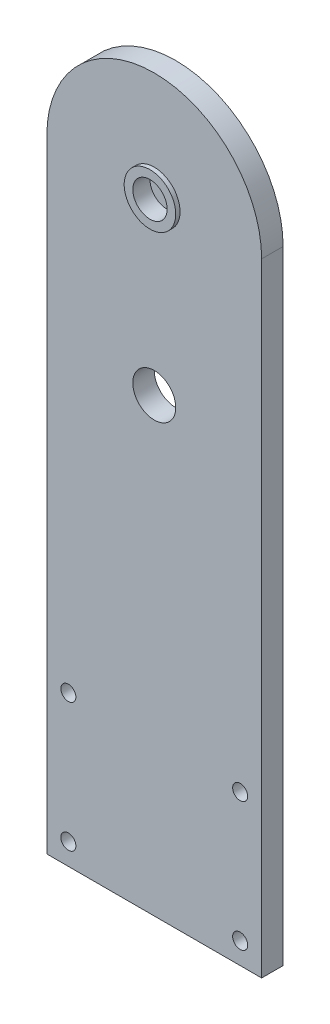
ISO-10303-21;
HEADER;
FILE_DESCRIPTION(('STEP AP214'),'2;1');
FILE_NAME('part.step','',(''),(''),'','','');
FILE_SCHEMA(('AUTOMOTIVE_DESIGN { 1 0 10303 214 1 1 1 1 }'));
ENDSEC;
DATA;
#1=APPLICATION_CONTEXT('core data for automotive mechanical design processes');
#2=APPLICATION_PROTOCOL_DEFINITION('international standard','automotive_design',2000,#1);
#3=PRODUCT_CONTEXT('',#1,'mechanical');
#4=PRODUCT('Part','Part','',(#3));
#5=PRODUCT_RELATED_PRODUCT_CATEGORY('part','',(#4));
#6=PRODUCT_DEFINITION_FORMATION('','',#4);
#7=PRODUCT_DEFINITION_CONTEXT('part definition',#1,'design');
#8=PRODUCT_DEFINITION('design','',#6,#7);
#9=PRODUCT_DEFINITION_SHAPE('','',#8);
#10=(LENGTH_UNIT() NAMED_UNIT(*) SI_UNIT(.MILLI.,.METRE.));
#11=(NAMED_UNIT(*) PLANE_ANGLE_UNIT() SI_UNIT($,.RADIAN.));
#12=(NAMED_UNIT(*) SI_UNIT($,.STERADIAN.) SOLID_ANGLE_UNIT());
#13=UNCERTAINTY_MEASURE_WITH_UNIT(LENGTH_MEASURE(1.E-05),#10,'distance_accuracy_value','');
#14=(GEOMETRIC_REPRESENTATION_CONTEXT(3) GLOBAL_UNCERTAINTY_ASSIGNED_CONTEXT((#13)) GLOBAL_UNIT_ASSIGNED_CONTEXT((#10,
#11,#12)) REPRESENTATION_CONTEXT('',''));
#15=CARTESIAN_POINT('',(0.,0.,0.));
#16=DIRECTION('',(0.,0.,1.));
#17=DIRECTION('',(1.,0.,0.));
#18=AXIS2_PLACEMENT_3D('',#15,#16,#17);
#19=CARTESIAN_POINT('',(0.,0.,5.));
#20=DIRECTION('',(0.,0.,1.));
#21=DIRECTION('',(1.,0.,0.));
#22=AXIS2_PLACEMENT_3D('',#19,#20,#21);
#23=PLANE('',#22);
#24=CARTESIAN_POINT('',(0.,-40.,5.));
#25=DIRECTION('',(0.,0.,1.));
#26=DIRECTION('',(1.,0.,0.));
#27=AXIS2_PLACEMENT_3D('',#24,#25,#26);
#28=CIRCLE('',#27,5.);
#29=CARTESIAN_POINT('',(5.,-40.,5.));
#30=VERTEX_POINT('',#29);
#31=EDGE_CURVE('E147',#30,#30,#28,.T.);
#32=ORIENTED_EDGE('',*,*,#31,.F.);
#33=EDGE_LOOP('',(#32));
#34=FACE_BOUND('',#33,.T.);
#35=CARTESIAN_POINT('',(20.,-140.,5.));
#36=DIRECTION('',(0.,0.,1.));
#37=DIRECTION('',(-1.,0.,0.));
#38=AXIS2_PLACEMENT_3D('',#35,#36,#37);
#39=CIRCLE('',#38,1.75);
#40=CARTESIAN_POINT('',(18.25,-140.,5.));
#41=VERTEX_POINT('',#40);
#42=EDGE_CURVE('E141',#41,#41,#39,.T.);
#43=ORIENTED_EDGE('',*,*,#42,.F.);
#44=EDGE_LOOP('',(#43));
#45=FACE_BOUND('',#44,.T.);
#46=CARTESIAN_POINT('',(20.,-110.,5.));
#47=DIRECTION('',(0.,0.,1.));
#48=DIRECTION('',(-1.,0.,0.));
#49=AXIS2_PLACEMENT_3D('',#46,#47,#48);
#50=CIRCLE('',#49,1.75);
#51=CARTESIAN_POINT('',(18.25,-110.,5.));
#52=VERTEX_POINT('',#51);
#53=EDGE_CURVE('E135',#52,#52,#50,.T.);
#54=ORIENTED_EDGE('',*,*,#53,.F.);
#55=EDGE_LOOP('',(#54));
#56=FACE_BOUND('',#55,.T.);
#57=CARTESIAN_POINT('',(-20.,-110.,5.));
#58=DIRECTION('',(0.,0.,1.));
#59=DIRECTION('',(1.,0.,0.));
#60=AXIS2_PLACEMENT_3D('',#57,#58,#59);
#61=CIRCLE('',#60,1.75);
#62=CARTESIAN_POINT('',(-18.25,-110.,5.));
#63=VERTEX_POINT('',#62);
#64=EDGE_CURVE('E129',#63,#63,#61,.T.);
#65=ORIENTED_EDGE('',*,*,#64,.F.);
#66=EDGE_LOOP('',(#65));
#67=FACE_BOUND('',#66,.T.);
#68=CARTESIAN_POINT('',(-20.,-140.,5.));
#69=DIRECTION('',(0.,0.,1.));
#70=DIRECTION('',(1.,0.,0.));
#71=AXIS2_PLACEMENT_3D('',#68,#69,#70);
#72=CIRCLE('',#71,1.75);
#73=CARTESIAN_POINT('',(-18.25,-140.,5.));
#74=VERTEX_POINT('',#73);
#75=EDGE_CURVE('E123',#74,#74,#72,.T.);
#76=ORIENTED_EDGE('',*,*,#75,.F.);
#77=EDGE_LOOP('',(#76));
#78=FACE_BOUND('',#77,.T.);
#79=DIRECTION('',(0.,-1.,0.));
#80=VECTOR('',#79,1.);
#81=CARTESIAN_POINT('',(-25.,-145.,5.));
#82=LINE('',#81,#80);
#83=CARTESIAN_POINT('',(-25.,0.,5.));
#84=VERTEX_POINT('',#83);
#85=CARTESIAN_POINT('',(-25.,-145.,5.));
#86=VERTEX_POINT('',#85);
#87=EDGE_CURVE('E85',#84,#86,#82,.T.);
#88=ORIENTED_EDGE('',*,*,#87,.T.);
#89=DIRECTION('',(1.,0.,0.));
#90=VECTOR('',#89,1.);
#91=CARTESIAN_POINT('',(-25.,-145.,5.));
#92=LINE('',#91,#90);
#93=CARTESIAN_POINT('',(25.,-145.,5.));
#94=VERTEX_POINT('',#93);
#95=EDGE_CURVE('E80',#86,#94,#92,.T.);
#96=ORIENTED_EDGE('',*,*,#95,.T.);
#97=DIRECTION('',(0.,1.,0.));
#98=VECTOR('',#97,1.);
#99=CARTESIAN_POINT('',(25.,-145.,5.));
#100=LINE('',#99,#98);
#101=CARTESIAN_POINT('',(25.,0.,5.));
#102=VERTEX_POINT('',#101);
#103=EDGE_CURVE('E83',#94,#102,#100,.T.);
#104=ORIENTED_EDGE('',*,*,#103,.T.);
#105=CARTESIAN_POINT('',(0.,0.,5.));
#106=DIRECTION('',(0.,0.,1.));
#107=DIRECTION('',(1.,0.,0.));
#108=AXIS2_PLACEMENT_3D('',#105,#106,#107);
#109=CIRCLE('',#108,25.);
#110=EDGE_CURVE('E50',#102,#84,#109,.T.);
#111=ORIENTED_EDGE('',*,*,#110,.T.);
#112=EDGE_LOOP('',(#88,#96,#104,#111));
#113=FACE_BOUND('',#112,.T.);
#114=CARTESIAN_POINT('',(0.,0.,5.));
#115=DIRECTION('',(0.,0.,1.));
#116=DIRECTION('',(1.,0.,0.));
#117=AXIS2_PLACEMENT_3D('',#114,#115,#116);
#118=CIRCLE('',#117,6.);
#119=CARTESIAN_POINT('',(6.,0.,5.));
#120=VERTEX_POINT('',#119);
#121=EDGE_CURVE('E114',#120,#120,#118,.T.);
#122=ORIENTED_EDGE('',*,*,#121,.F.);
#123=EDGE_LOOP('',(#122));
#124=FACE_BOUND('',#123,.T.);
#125=ADVANCED_FACE('F33',(#34,#45,#56,#67,#78,#113,#124),#23,.T.);
#126=CARTESIAN_POINT('',(-25.,-145.,5.));
#127=DIRECTION('',(1.,0.,0.));
#128=DIRECTION('',(0.,0.,-1.));
#129=AXIS2_PLACEMENT_3D('',#126,#127,#128);
#130=PLANE('',#129);
#131=DIRECTION('',(0.,-1.,0.));
#132=VECTOR('',#131,1.);
#133=CARTESIAN_POINT('',(-25.,-145.,0.));
#134=LINE('',#133,#132);
#135=CARTESIAN_POINT('',(-25.,0.,0.));
#136=VERTEX_POINT('',#135);
#137=CARTESIAN_POINT('',(-25.,-145.,0.));
#138=VERTEX_POINT('',#137);
#139=EDGE_CURVE('E97',#136,#138,#134,.T.);
#140=ORIENTED_EDGE('',*,*,#139,.T.);
#141=DIRECTION('',(0.,0.,-1.));
#142=VECTOR('',#141,1.);
#143=CARTESIAN_POINT('',(-25.,-145.,5.));
#144=LINE('',#143,#142);
#145=EDGE_CURVE('E11',#86,#138,#144,.T.);
#146=ORIENTED_EDGE('',*,*,#145,.F.);
#147=ORIENTED_EDGE('',*,*,#87,.F.);
#148=DIRECTION('',(0.,0.,-1.));
#149=VECTOR('',#148,1.);
#150=CARTESIAN_POINT('',(-25.,0.,5.));
#151=LINE('',#150,#149);
#152=EDGE_CURVE('E93',#84,#136,#151,.T.);
#153=ORIENTED_EDGE('',*,*,#152,.T.);
#154=EDGE_LOOP('',(#140,#146,#147,#153));
#155=FACE_BOUND('',#154,.T.);
#156=ADVANCED_FACE('F35',(#155),#130,.F.);
#157=CARTESIAN_POINT('',(-25.,-145.,5.));
#158=DIRECTION('',(0.,1.,0.));
#159=DIRECTION('',(0.,0.,1.));
#160=AXIS2_PLACEMENT_3D('',#157,#158,#159);
#161=PLANE('',#160);
#162=DIRECTION('',(1.,0.,0.));
#163=VECTOR('',#162,1.);
#164=CARTESIAN_POINT('',(-25.,-145.,0.));
#165=LINE('',#164,#163);
#166=CARTESIAN_POINT('',(25.,-145.,0.));
#167=VERTEX_POINT('',#166);
#168=EDGE_CURVE('E89',#138,#167,#165,.T.);
#169=ORIENTED_EDGE('',*,*,#168,.T.);
#170=DIRECTION('',(0.,0.,-1.));
#171=VECTOR('',#170,1.);
#172=CARTESIAN_POINT('',(25.,-145.,5.));
#173=LINE('',#172,#171);
#174=EDGE_CURVE('E42',#94,#167,#173,.T.);
#175=ORIENTED_EDGE('',*,*,#174,.F.);
#176=ORIENTED_EDGE('',*,*,#95,.F.);
#177=ORIENTED_EDGE('',*,*,#145,.T.);
#178=EDGE_LOOP('',(#169,#175,#176,#177));
#179=FACE_BOUND('',#178,.T.);
#180=ADVANCED_FACE('F88',(#179),#161,.F.);
#181=CARTESIAN_POINT('',(25.,-145.,5.));
#182=DIRECTION('',(-1.,0.,0.));
#183=DIRECTION('',(0.,0.,1.));
#184=AXIS2_PLACEMENT_3D('',#181,#182,#183);
#185=PLANE('',#184);
#186=DIRECTION('',(0.,1.,0.));
#187=VECTOR('',#186,1.);
#188=CARTESIAN_POINT('',(25.,-145.,0.));
#189=LINE('',#188,#187);
#190=CARTESIAN_POINT('',(25.,0.,0.));
#191=VERTEX_POINT('',#190);
#192=EDGE_CURVE('E67',#167,#191,#189,.T.);
#193=ORIENTED_EDGE('',*,*,#192,.T.);
#194=DIRECTION('',(0.,0.,-1.));
#195=VECTOR('',#194,1.);
#196=CARTESIAN_POINT('',(25.,0.,5.));
#197=LINE('',#196,#195);
#198=EDGE_CURVE('E90',#102,#191,#197,.T.);
#199=ORIENTED_EDGE('',*,*,#198,.F.);
#200=ORIENTED_EDGE('',*,*,#103,.F.);
#201=ORIENTED_EDGE('',*,*,#174,.T.);
#202=EDGE_LOOP('',(#193,#199,#200,#201));
#203=FACE_BOUND('',#202,.T.);
#204=ADVANCED_FACE('F91',(#203),#185,.F.);
#205=CARTESIAN_POINT('',(0.,0.,5.));
#206=DIRECTION('',(0.,0.,-1.));
#207=DIRECTION('',(-1.,0.,0.));
#208=AXIS2_PLACEMENT_3D('',#205,#206,#207);
#209=CYLINDRICAL_SURFACE('',#208,25.);
#210=CARTESIAN_POINT('',(0.,0.,0.));
#211=DIRECTION('',(0.,0.,1.));
#212=DIRECTION('',(1.,0.,0.));
#213=AXIS2_PLACEMENT_3D('',#210,#211,#212);
#214=CIRCLE('',#213,25.);
#215=EDGE_CURVE('E73',#191,#136,#214,.T.);
#216=ORIENTED_EDGE('',*,*,#215,.T.);
#217=ORIENTED_EDGE('',*,*,#152,.F.);
#218=ORIENTED_EDGE('',*,*,#110,.F.);
#219=ORIENTED_EDGE('',*,*,#198,.T.);
#220=EDGE_LOOP('',(#216,#217,#218,#219));
#221=FACE_BOUND('',#220,.T.);
#222=ADVANCED_FACE('F105',(#221),#209,.T.);
#223=CARTESIAN_POINT('',(0.,0.,0.));
#224=DIRECTION('',(0.,0.,1.));
#225=DIRECTION('',(1.,0.,0.));
#226=AXIS2_PLACEMENT_3D('',#223,#224,#225);
#227=PLANE('',#226);
#228=CARTESIAN_POINT('',(0.,-40.,0.));
#229=DIRECTION('',(0.,0.,1.));
#230=DIRECTION('',(1.,0.,0.));
#231=AXIS2_PLACEMENT_3D('',#228,#229,#230);
#232=CIRCLE('',#231,5.);
#233=CARTESIAN_POINT('',(5.,-40.,0.));
#234=VERTEX_POINT('',#233);
#235=EDGE_CURVE('E144',#234,#234,#232,.T.);
#236=ORIENTED_EDGE('',*,*,#235,.T.);
#237=EDGE_LOOP('',(#236));
#238=FACE_BOUND('',#237,.T.);
#239=CARTESIAN_POINT('',(20.,-140.,0.));
#240=DIRECTION('',(0.,0.,1.));
#241=DIRECTION('',(-1.,0.,0.));
#242=AXIS2_PLACEMENT_3D('',#239,#240,#241);
#243=CIRCLE('',#242,1.75);
#244=CARTESIAN_POINT('',(18.25,-140.,0.));
#245=VERTEX_POINT('',#244);
#246=EDGE_CURVE('E138',#245,#245,#243,.T.);
#247=ORIENTED_EDGE('',*,*,#246,.T.);
#248=EDGE_LOOP('',(#247));
#249=FACE_BOUND('',#248,.T.);
#250=CARTESIAN_POINT('',(20.,-110.,0.));
#251=DIRECTION('',(0.,0.,1.));
#252=DIRECTION('',(-1.,0.,0.));
#253=AXIS2_PLACEMENT_3D('',#250,#251,#252);
#254=CIRCLE('',#253,1.75);
#255=CARTESIAN_POINT('',(18.25,-110.,0.));
#256=VERTEX_POINT('',#255);
#257=EDGE_CURVE('E132',#256,#256,#254,.T.);
#258=ORIENTED_EDGE('',*,*,#257,.T.);
#259=EDGE_LOOP('',(#258));
#260=FACE_BOUND('',#259,.T.);
#261=CARTESIAN_POINT('',(-20.,-110.,0.));
#262=DIRECTION('',(0.,0.,1.));
#263=DIRECTION('',(1.,0.,0.));
#264=AXIS2_PLACEMENT_3D('',#261,#262,#263);
#265=CIRCLE('',#264,1.75);
#266=CARTESIAN_POINT('',(-18.25,-110.,0.));
#267=VERTEX_POINT('',#266);
#268=EDGE_CURVE('E126',#267,#267,#265,.T.);
#269=ORIENTED_EDGE('',*,*,#268,.T.);
#270=EDGE_LOOP('',(#269));
#271=FACE_BOUND('',#270,.T.);
#272=CARTESIAN_POINT('',(-20.,-140.,0.));
#273=DIRECTION('',(0.,0.,1.));
#274=DIRECTION('',(1.,0.,0.));
#275=AXIS2_PLACEMENT_3D('',#272,#273,#274);
#276=CIRCLE('',#275,1.75);
#277=CARTESIAN_POINT('',(-18.25,-140.,0.));
#278=VERTEX_POINT('',#277);
#279=EDGE_CURVE('E122',#278,#278,#276,.T.);
#280=ORIENTED_EDGE('',*,*,#279,.T.);
#281=EDGE_LOOP('',(#280));
#282=FACE_BOUND('',#281,.T.);
#283=ORIENTED_EDGE('',*,*,#139,.F.);
#284=ORIENTED_EDGE('',*,*,#215,.F.);
#285=ORIENTED_EDGE('',*,*,#192,.F.);
#286=ORIENTED_EDGE('',*,*,#168,.F.);
#287=EDGE_LOOP('',(#283,#284,#285,#286));
#288=FACE_BOUND('',#287,.T.);
#289=ADVANCED_FACE('F108',(#238,#249,#260,#271,#282,#288),#227,.F.);
#290=CARTESIAN_POINT('',(0.,0.,6.));
#291=DIRECTION('',(0.,0.,1.));
#292=DIRECTION('',(1.,0.,0.));
#293=AXIS2_PLACEMENT_3D('',#290,#291,#292);
#294=PLANE('',#293);
#295=CARTESIAN_POINT('',(0.,0.,6.));
#296=DIRECTION('',(0.,0.,1.));
#297=DIRECTION('',(1.,0.,0.));
#298=AXIS2_PLACEMENT_3D('',#295,#296,#297);
#299=CIRCLE('',#298,6.);
#300=CARTESIAN_POINT('',(6.,0.,6.));
#301=VERTEX_POINT('',#300);
#302=EDGE_CURVE('E113',#301,#301,#299,.T.);
#303=ORIENTED_EDGE('',*,*,#302,.T.);
#304=EDGE_LOOP('',(#303));
#305=FACE_BOUND('',#304,.T.);
#306=CARTESIAN_POINT('',(0.,0.,6.));
#307=DIRECTION('',(0.,0.,1.));
#308=DIRECTION('',(1.,0.,0.));
#309=AXIS2_PLACEMENT_3D('',#306,#307,#308);
#310=CIRCLE('',#309,4.);
#311=CARTESIAN_POINT('',(4.,0.,6.));
#312=VERTEX_POINT('',#311);
#313=EDGE_CURVE('E117',#312,#312,#310,.T.);
#314=ORIENTED_EDGE('',*,*,#313,.F.);
#315=EDGE_LOOP('',(#314));
#316=FACE_BOUND('',#315,.T.);
#317=ADVANCED_FACE('F192',(#305,#316),#294,.T.);
#318=CARTESIAN_POINT('',(0.,0.,6.));
#319=DIRECTION('',(0.,0.,-1.));
#320=DIRECTION('',(-1.,0.,0.));
#321=AXIS2_PLACEMENT_3D('',#318,#319,#320);
#322=CYLINDRICAL_SURFACE('',#321,6.);
#323=ORIENTED_EDGE('',*,*,#302,.F.);
#324=EDGE_LOOP('',(#323));
#325=FACE_BOUND('',#324,.T.);
#326=ORIENTED_EDGE('',*,*,#121,.T.);
#327=EDGE_LOOP('',(#326));
#328=FACE_BOUND('',#327,.T.);
#329=ADVANCED_FACE('F195',(#325,#328),#322,.T.);
#330=CARTESIAN_POINT('',(0.,0.,2.));
#331=DIRECTION('',(0.,0.,1.));
#332=DIRECTION('',(1.,0.,0.));
#333=AXIS2_PLACEMENT_3D('',#330,#331,#332);
#334=PLANE('',#333);
#335=CARTESIAN_POINT('',(0.,0.,2.));
#336=DIRECTION('',(0.,0.,1.));
#337=DIRECTION('',(1.,0.,0.));
#338=AXIS2_PLACEMENT_3D('',#335,#336,#337);
#339=CIRCLE('',#338,4.);
#340=CARTESIAN_POINT('',(4.,0.,2.));
#341=VERTEX_POINT('',#340);
#342=EDGE_CURVE('E100',#341,#341,#339,.T.);
#343=ORIENTED_EDGE('',*,*,#342,.T.);
#344=EDGE_LOOP('',(#343));
#345=FACE_BOUND('',#344,.T.);
#346=ADVANCED_FACE('F186',(#345),#334,.T.);
#347=CARTESIAN_POINT('',(0.,0.,2.));
#348=DIRECTION('',(0.,0.,1.));
#349=DIRECTION('',(1.,0.,0.));
#350=AXIS2_PLACEMENT_3D('',#347,#348,#349);
#351=CYLINDRICAL_SURFACE('',#350,4.);
#352=ORIENTED_EDGE('',*,*,#342,.F.);
#353=EDGE_LOOP('',(#352));
#354=FACE_BOUND('',#353,.T.);
#355=ORIENTED_EDGE('',*,*,#313,.T.);
#356=EDGE_LOOP('',(#355));
#357=FACE_BOUND('',#356,.T.);
#358=ADVANCED_FACE('F176',(#354,#357),#351,.F.);
#359=CARTESIAN_POINT('',(-20.,-140.,0.));
#360=DIRECTION('',(0.,0.,1.));
#361=DIRECTION('',(1.,0.,0.));
#362=AXIS2_PLACEMENT_3D('',#359,#360,#361);
#363=CYLINDRICAL_SURFACE('',#362,1.75);
#364=ORIENTED_EDGE('',*,*,#279,.F.);
#365=EDGE_LOOP('',(#364));
#366=FACE_BOUND('',#365,.T.);
#367=ORIENTED_EDGE('',*,*,#75,.T.);
#368=EDGE_LOOP('',(#367));
#369=FACE_BOUND('',#368,.T.);
#370=ADVANCED_FACE('F173',(#366,#369),#363,.F.);
#371=CARTESIAN_POINT('',(-20.,-110.,0.));
#372=DIRECTION('',(0.,0.,1.));
#373=DIRECTION('',(1.,0.,0.));
#374=AXIS2_PLACEMENT_3D('',#371,#372,#373);
#375=CYLINDRICAL_SURFACE('',#374,1.75);
#376=ORIENTED_EDGE('',*,*,#268,.F.);
#377=EDGE_LOOP('',(#376));
#378=FACE_BOUND('',#377,.T.);
#379=ORIENTED_EDGE('',*,*,#64,.T.);
#380=EDGE_LOOP('',(#379));
#381=FACE_BOUND('',#380,.T.);
#382=ADVANCED_FACE('F175',(#378,#381),#375,.F.);
#383=CARTESIAN_POINT('',(20.,-110.,0.));
#384=DIRECTION('',(0.,0.,1.));
#385=DIRECTION('',(1.,0.,0.));
#386=AXIS2_PLACEMENT_3D('',#383,#384,#385);
#387=CYLINDRICAL_SURFACE('',#386,1.75);
#388=ORIENTED_EDGE('',*,*,#257,.F.);
#389=EDGE_LOOP('',(#388));
#390=FACE_BOUND('',#389,.T.);
#391=ORIENTED_EDGE('',*,*,#53,.T.);
#392=EDGE_LOOP('',(#391));
#393=FACE_BOUND('',#392,.T.);
#394=ADVANCED_FACE('F183',(#390,#393),#387,.F.);
#395=CARTESIAN_POINT('',(20.,-140.,0.));
#396=DIRECTION('',(0.,0.,1.));
#397=DIRECTION('',(1.,0.,0.));
#398=AXIS2_PLACEMENT_3D('',#395,#396,#397);
#399=CYLINDRICAL_SURFACE('',#398,1.75);
#400=ORIENTED_EDGE('',*,*,#246,.F.);
#401=EDGE_LOOP('',(#400));
#402=FACE_BOUND('',#401,.T.);
#403=ORIENTED_EDGE('',*,*,#42,.T.);
#404=EDGE_LOOP('',(#403));
#405=FACE_BOUND('',#404,.T.);
#406=ADVANCED_FACE('F158',(#402,#405),#399,.F.);
#407=CARTESIAN_POINT('',(0.,-40.,0.));
#408=DIRECTION('',(0.,0.,1.));
#409=DIRECTION('',(1.,0.,0.));
#410=AXIS2_PLACEMENT_3D('',#407,#408,#409);
#411=CYLINDRICAL_SURFACE('',#410,5.);
#412=ORIENTED_EDGE('',*,*,#235,.F.);
#413=EDGE_LOOP('',(#412));
#414=FACE_BOUND('',#413,.T.);
#415=ORIENTED_EDGE('',*,*,#31,.T.);
#416=EDGE_LOOP('',(#415));
#417=FACE_BOUND('',#416,.T.);
#418=ADVANCED_FACE('F155',(#414,#417),#411,.F.);
#419=CLOSED_SHELL('',(#125,#156,#180,#204,#222,#289,#317,#329,#346,#358,#370,#382,#394,#406,#418));
#420=MANIFOLD_SOLID_BREP('B2',#419);
#421=ADVANCED_BREP_SHAPE_REPRESENTATION('',(#18,#420),#14);
#422=SHAPE_DEFINITION_REPRESENTATION(#9,#421);
ENDSEC;
END-ISO-10303-21;
